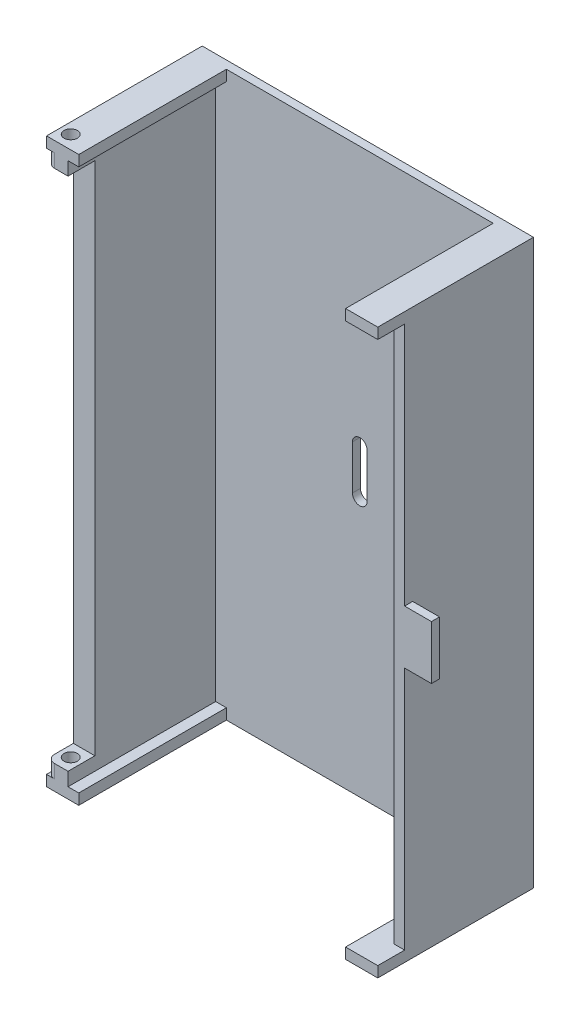
ISO-10303-21;
HEADER;
FILE_DESCRIPTION(('STEP AP214'),'2;1');
FILE_NAME('part.step','',(''),(''),'','','');
FILE_SCHEMA(('AUTOMOTIVE_DESIGN { 1 0 10303 214 1 1 1 1 }'));
ENDSEC;
DATA;
#1=APPLICATION_CONTEXT('core data for automotive mechanical design processes');
#2=APPLICATION_PROTOCOL_DEFINITION('international standard','automotive_design',2000,#1);
#3=PRODUCT_CONTEXT('',#1,'mechanical');
#4=PRODUCT('Part','Part','',(#3));
#5=PRODUCT_RELATED_PRODUCT_CATEGORY('part','',(#4));
#6=PRODUCT_DEFINITION_FORMATION('','',#4);
#7=PRODUCT_DEFINITION_CONTEXT('part definition',#1,'design');
#8=PRODUCT_DEFINITION('design','',#6,#7);
#9=PRODUCT_DEFINITION_SHAPE('','',#8);
#10=(LENGTH_UNIT() NAMED_UNIT(*) SI_UNIT(.MILLI.,.METRE.));
#11=(NAMED_UNIT(*) PLANE_ANGLE_UNIT() SI_UNIT($,.RADIAN.));
#12=(NAMED_UNIT(*) SI_UNIT($,.STERADIAN.) SOLID_ANGLE_UNIT());
#13=UNCERTAINTY_MEASURE_WITH_UNIT(LENGTH_MEASURE(1.E-05),#10,'distance_accuracy_value','');
#14=(GEOMETRIC_REPRESENTATION_CONTEXT(3) GLOBAL_UNCERTAINTY_ASSIGNED_CONTEXT((#13)) GLOBAL_UNIT_ASSIGNED_CONTEXT((#10,
#11,#12)) REPRESENTATION_CONTEXT('',''));
#15=CARTESIAN_POINT('',(0.,0.,0.));
#16=DIRECTION('',(0.,0.,1.));
#17=DIRECTION('',(1.,0.,0.));
#18=AXIS2_PLACEMENT_3D('',#15,#16,#17);
#19=CARTESIAN_POINT('',(2.95000000000002,-116.,58.));
#20=DIRECTION('',(0.,1.,0.));
#21=DIRECTION('',(0.,0.,1.));
#22=AXIS2_PLACEMENT_3D('',#19,#20,#21);
#23=PLANE('',#22);
#24=DIRECTION('',(0.,0.,-1.));
#25=VECTOR('',#24,1.);
#26=CARTESIAN_POINT('',(-58.75,-116.,58.));
#27=LINE('',#26,#25);
#28=CARTESIAN_POINT('',(-58.75,-116.,58.));
#29=VERTEX_POINT('',#28);
#30=CARTESIAN_POINT('',(-58.75,-116.,55.));
#31=VERTEX_POINT('',#30);
#32=EDGE_CURVE('E489',#29,#31,#27,.T.);
#33=ORIENTED_EDGE('',*,*,#32,.F.);
#34=DIRECTION('',(1.,0.,0.));
#35=VECTOR('',#34,1.);
#36=CARTESIAN_POINT('',(2.95000000000002,-116.,58.));
#37=LINE('',#36,#35);
#38=CARTESIAN_POINT('',(-55.75,-116.,57.9999999999996));
#39=VERTEX_POINT('',#38);
#40=EDGE_CURVE('E297',#29,#39,#37,.T.);
#41=ORIENTED_EDGE('',*,*,#40,.T.);
#42=CARTESIAN_POINT('',(-55.75,-116.,55.));
#43=DIRECTION('',(0.,1.,0.));
#44=DIRECTION('',(0.,0.,1.));
#45=AXIS2_PLACEMENT_3D('',#42,#43,#44);
#46=CIRCLE('',#45,3.);
#47=EDGE_CURVE('E47',#39,#31,#46,.F.);
#48=ORIENTED_EDGE('',*,*,#47,.T.);
#49=EDGE_LOOP('',(#33,#41,#48));
#50=FACE_BOUND('',#49,.T.);
#51=ADVANCED_FACE('F39',(#50),#23,.T.);
#52=CARTESIAN_POINT('',(-50.75,-116.,58.));
#53=VERTEX_POINT('',#52);
#54=CARTESIAN_POINT('',(-46.75,-116.,58.));
#55=VERTEX_POINT('',#54);
#56=EDGE_CURVE('E298',#53,#55,#37,.T.);
#57=ORIENTED_EDGE('',*,*,#56,.T.);
#58=DIRECTION('',(0.,0.,-1.));
#59=VECTOR('',#58,1.);
#60=CARTESIAN_POINT('',(-46.75,-116.,58.));
#61=LINE('',#60,#59);
#62=CARTESIAN_POINT('',(-46.75,-116.,3.00000000000001));
#63=VERTEX_POINT('',#62);
#64=EDGE_CURVE('E312',#55,#63,#61,.T.);
#65=ORIENTED_EDGE('',*,*,#64,.T.);
#66=DIRECTION('',(1.,0.,0.));
#67=VECTOR('',#66,1.);
#68=CARTESIAN_POINT('',(64.65,-116.,3.00000000000002));
#69=LINE('',#68,#67);
#70=CARTESIAN_POINT('',(-50.75,-116.,3.));
#71=VERTEX_POINT('',#70);
#72=EDGE_CURVE('E451',#71,#63,#69,.T.);
#73=ORIENTED_EDGE('',*,*,#72,.F.);
#74=DIRECTION('',(0.,0.,1.));
#75=VECTOR('',#74,1.);
#76=CARTESIAN_POINT('',(-50.75,-116.,58.));
#77=LINE('',#76,#75);
#78=EDGE_CURVE('E401',#71,#53,#77,.T.);
#79=ORIENTED_EDGE('',*,*,#78,.T.);
#80=EDGE_LOOP('',(#57,#65,#73,#79));
#81=FACE_BOUND('',#80,.T.);
#82=ADVANCED_FACE('F529',(#81),#23,.T.);
#83=CARTESIAN_POINT('',(2.95000000000001,86.,58.));
#84=DIRECTION('',(0.,1.,0.));
#85=DIRECTION('',(0.,0.,1.));
#86=AXIS2_PLACEMENT_3D('',#83,#84,#85);
#87=PLANE('',#86);
#88=DIRECTION('',(1.,0.,0.));
#89=VECTOR('',#88,1.);
#90=CARTESIAN_POINT('',(2.95000000000001,86.,58.));
#91=LINE('',#90,#89);
#92=CARTESIAN_POINT('',(-58.75,86.,58.));
#93=VERTEX_POINT('',#92);
#94=CARTESIAN_POINT('',(-55.75,86.,58.));
#95=VERTEX_POINT('',#94);
#96=EDGE_CURVE('E295',#93,#95,#91,.T.);
#97=ORIENTED_EDGE('',*,*,#96,.F.);
#98=DIRECTION('',(0.,0.,1.));
#99=VECTOR('',#98,1.);
#100=CARTESIAN_POINT('',(-58.75,86.,3.));
#101=LINE('',#100,#99);
#102=CARTESIAN_POINT('',(-58.75,86.,55.));
#103=VERTEX_POINT('',#102);
#104=EDGE_CURVE('E481',#103,#93,#101,.T.);
#105=ORIENTED_EDGE('',*,*,#104,.F.);
#106=CARTESIAN_POINT('',(-55.75,86.,55.));
#107=DIRECTION('',(0.,1.,0.));
#108=DIRECTION('',(0.,0.,1.));
#109=AXIS2_PLACEMENT_3D('',#106,#107,#108);
#110=CIRCLE('',#109,3.);
#111=EDGE_CURVE('E11',#103,#95,#110,.T.);
#112=ORIENTED_EDGE('',*,*,#111,.T.);
#113=EDGE_LOOP('',(#97,#105,#112));
#114=FACE_BOUND('',#113,.T.);
#115=ADVANCED_FACE('F556',(#114),#87,.F.);
#116=DIRECTION('',(0.,0.,-1.));
#117=VECTOR('',#116,1.);
#118=CARTESIAN_POINT('',(-46.75,86.,58.));
#119=LINE('',#118,#117);
#120=CARTESIAN_POINT('',(-46.75,86.,58.));
#121=VERTEX_POINT('',#120);
#122=CARTESIAN_POINT('',(-46.75,86.,3.00000000000001));
#123=VERTEX_POINT('',#122);
#124=EDGE_CURVE('E310',#121,#123,#119,.T.);
#125=ORIENTED_EDGE('',*,*,#124,.F.);
#126=CARTESIAN_POINT('',(-50.75,86.,58.));
#127=VERTEX_POINT('',#126);
#128=EDGE_CURVE('E267',#127,#121,#91,.T.);
#129=ORIENTED_EDGE('',*,*,#128,.F.);
#130=DIRECTION('',(0.,0.,-1.));
#131=VECTOR('',#130,1.);
#132=CARTESIAN_POINT('',(-50.75,86.,3.));
#133=LINE('',#132,#131);
#134=CARTESIAN_POINT('',(-50.75,86.,3.));
#135=VERTEX_POINT('',#134);
#136=EDGE_CURVE('E419',#127,#135,#133,.T.);
#137=ORIENTED_EDGE('',*,*,#136,.T.);
#138=DIRECTION('',(-1.,0.,0.));
#139=VECTOR('',#138,1.);
#140=CARTESIAN_POINT('',(64.65,86.,3.));
#141=LINE('',#140,#139);
#142=EDGE_CURVE('E432',#123,#135,#141,.T.);
#143=ORIENTED_EDGE('',*,*,#142,.F.);
#144=EDGE_LOOP('',(#125,#129,#137,#143));
#145=FACE_BOUND('',#144,.T.);
#146=ADVANCED_FACE('F540',(#145),#87,.F.);
#147=CARTESIAN_POINT('',(-58.75,90.,3.));
#148=DIRECTION('',(0.,-1.,0.));
#149=DIRECTION('',(1.,0.,0.));
#150=AXIS2_PLACEMENT_3D('',#147,#148,#149);
#151=PLANE('',#150);
#152=CARTESIAN_POINT('',(-54.75,90.,53.));
#153=DIRECTION('',(0.,-1.,0.));
#154=DIRECTION('',(0.,0.,-1.));
#155=AXIS2_PLACEMENT_3D('',#152,#153,#154);
#156=CIRCLE('',#155,2.5);
#157=CARTESIAN_POINT('',(-54.75,90.,50.5));
#158=VERTEX_POINT('',#157);
#159=EDGE_CURVE('E374',#158,#158,#156,.T.);
#160=ORIENTED_EDGE('',*,*,#159,.T.);
#161=EDGE_LOOP('',(#160));
#162=FACE_BOUND('',#161,.T.);
#163=DIRECTION('',(1.,0.,0.));
#164=VECTOR('',#163,1.);
#165=CARTESIAN_POINT('',(-99.800979040538,90.,58.));
#166=LINE('',#165,#164);
#167=CARTESIAN_POINT('',(-58.75,90.,58.));
#168=VERTEX_POINT('',#167);
#169=CARTESIAN_POINT('',(-46.75,90.,58.));
#170=VERTEX_POINT('',#169);
#171=EDGE_CURVE('E265',#168,#170,#166,.T.);
#172=ORIENTED_EDGE('',*,*,#171,.T.);
#173=DIRECTION('',(0.,0.,-1.));
#174=VECTOR('',#173,1.);
#175=CARTESIAN_POINT('',(-46.75,90.,0.));
#176=LINE('',#175,#174);
#177=CARTESIAN_POINT('',(-46.75,90.,3.00000000000001));
#178=VERTEX_POINT('',#177);
#179=EDGE_CURVE('E274',#170,#178,#176,.T.);
#180=ORIENTED_EDGE('',*,*,#179,.T.);
#181=DIRECTION('',(-1.,0.,0.));
#182=VECTOR('',#181,1.);
#183=CARTESIAN_POINT('',(0.,90.,3.00000000000001));
#184=LINE('',#183,#182);
#185=CARTESIAN_POINT('',(52.65,90.,3.));
#186=VERTEX_POINT('',#185);
#187=EDGE_CURVE('E271',#186,#178,#184,.T.);
#188=ORIENTED_EDGE('',*,*,#187,.F.);
#189=DIRECTION('',(0.,0.,-1.));
#190=VECTOR('',#189,1.);
#191=CARTESIAN_POINT('',(52.65,90.,0.));
#192=LINE('',#191,#190);
#193=CARTESIAN_POINT('',(52.65,90.,58.));
#194=VERTEX_POINT('',#193);
#195=EDGE_CURVE('E281',#194,#186,#192,.T.);
#196=ORIENTED_EDGE('',*,*,#195,.F.);
#197=CARTESIAN_POINT('',(64.65,90.,58.));
#198=VERTEX_POINT('',#197);
#199=EDGE_CURVE('E289',#194,#198,#166,.T.);
#200=ORIENTED_EDGE('',*,*,#199,.T.);
#201=DIRECTION('',(0.,0.,-1.));
#202=VECTOR('',#201,1.);
#203=CARTESIAN_POINT('',(64.65,90.,3.));
#204=LINE('',#203,#202);
#205=CARTESIAN_POINT('',(64.65,90.,0.));
#206=VERTEX_POINT('',#205);
#207=EDGE_CURVE('E478',#198,#206,#204,.T.);
#208=ORIENTED_EDGE('',*,*,#207,.T.);
#209=DIRECTION('',(-1.,0.,0.));
#210=VECTOR('',#209,1.);
#211=CARTESIAN_POINT('',(-58.75,90.,0.));
#212=LINE('',#211,#210);
#213=CARTESIAN_POINT('',(-58.75,90.,0.));
#214=VERTEX_POINT('',#213);
#215=EDGE_CURVE('E465',#206,#214,#212,.T.);
#216=ORIENTED_EDGE('',*,*,#215,.T.);
#217=DIRECTION('',(0.,0.,-1.));
#218=VECTOR('',#217,1.);
#219=CARTESIAN_POINT('',(-58.75,90.,3.));
#220=LINE('',#219,#218);
#221=EDGE_CURVE('E286',#168,#214,#220,.T.);
#222=ORIENTED_EDGE('',*,*,#221,.F.);
#223=EDGE_LOOP('',(#172,#180,#188,#196,#200,#208,#216,#222));
#224=FACE_BOUND('',#223,.T.);
#225=ADVANCED_FACE('F284',(#162,#224),#151,.F.);
#226=CARTESIAN_POINT('',(-58.75,-120.,3.));
#227=DIRECTION('',(0.,1.,0.));
#228=DIRECTION('',(-1.,0.,0.));
#229=AXIS2_PLACEMENT_3D('',#226,#227,#228);
#230=PLANE('',#229);
#231=CARTESIAN_POINT('',(-54.75,-120.,53.));
#232=DIRECTION('',(0.,1.,0.));
#233=DIRECTION('',(-1.,0.,0.));
#234=AXIS2_PLACEMENT_3D('',#231,#232,#233);
#235=CIRCLE('',#234,2.5);
#236=CARTESIAN_POINT('',(-57.25,-120.,53.));
#237=VERTEX_POINT('',#236);
#238=EDGE_CURVE('E394',#237,#237,#235,.F.);
#239=ORIENTED_EDGE('',*,*,#238,.F.);
#240=EDGE_LOOP('',(#239));
#241=FACE_BOUND('',#240,.T.);
#242=DIRECTION('',(-1.,0.,0.));
#243=VECTOR('',#242,1.);
#244=CARTESIAN_POINT('',(-99.8009790405379,-120.,58.));
#245=LINE('',#244,#243);
#246=CARTESIAN_POINT('',(-46.75,-120.,58.));
#247=VERTEX_POINT('',#246);
#248=CARTESIAN_POINT('',(-58.75,-120.,58.));
#249=VERTEX_POINT('',#248);
#250=EDGE_CURVE('E288',#247,#249,#245,.T.);
#251=ORIENTED_EDGE('',*,*,#250,.T.);
#252=DIRECTION('',(0.,0.,-1.));
#253=VECTOR('',#252,1.);
#254=CARTESIAN_POINT('',(-58.75,-120.,3.));
#255=LINE('',#254,#253);
#256=CARTESIAN_POINT('',(-58.75,-120.,0.));
#257=VERTEX_POINT('',#256);
#258=EDGE_CURVE('E474',#249,#257,#255,.T.);
#259=ORIENTED_EDGE('',*,*,#258,.T.);
#260=DIRECTION('',(1.,0.,0.));
#261=VECTOR('',#260,1.);
#262=CARTESIAN_POINT('',(-58.75,-120.,0.));
#263=LINE('',#262,#261);
#264=CARTESIAN_POINT('',(64.65,-120.,0.));
#265=VERTEX_POINT('',#264);
#266=EDGE_CURVE('E469',#257,#265,#263,.T.);
#267=ORIENTED_EDGE('',*,*,#266,.T.);
#268=DIRECTION('',(0.,0.,-1.));
#269=VECTOR('',#268,1.);
#270=CARTESIAN_POINT('',(64.65,-120.,3.));
#271=LINE('',#270,#269);
#272=CARTESIAN_POINT('',(64.65,-120.,58.));
#273=VERTEX_POINT('',#272);
#274=EDGE_CURVE('E471',#273,#265,#271,.T.);
#275=ORIENTED_EDGE('',*,*,#274,.F.);
#276=CARTESIAN_POINT('',(52.6500000000001,-120.,58.));
#277=VERTEX_POINT('',#276);
#278=EDGE_CURVE('E282',#273,#277,#245,.T.);
#279=ORIENTED_EDGE('',*,*,#278,.T.);
#280=DIRECTION('',(0.,0.,1.));
#281=VECTOR('',#280,1.);
#282=CARTESIAN_POINT('',(52.6500000000001,-120.,0.));
#283=LINE('',#282,#281);
#284=CARTESIAN_POINT('',(52.6500000000001,-120.,3.));
#285=VERTEX_POINT('',#284);
#286=EDGE_CURVE('E611',#285,#277,#283,.T.);
#287=ORIENTED_EDGE('',*,*,#286,.F.);
#288=DIRECTION('',(1.,0.,0.));
#289=VECTOR('',#288,1.);
#290=CARTESIAN_POINT('',(0.,-120.,3.00000000000001));
#291=LINE('',#290,#289);
#292=CARTESIAN_POINT('',(-46.75,-120.,3.00000000000001));
#293=VERTEX_POINT('',#292);
#294=EDGE_CURVE('E588',#293,#285,#291,.T.);
#295=ORIENTED_EDGE('',*,*,#294,.F.);
#296=DIRECTION('',(0.,0.,1.));
#297=VECTOR('',#296,1.);
#298=CARTESIAN_POINT('',(-46.75,-120.,0.));
#299=LINE('',#298,#297);
#300=EDGE_CURVE('E541',#293,#247,#299,.T.);
#301=ORIENTED_EDGE('',*,*,#300,.T.);
#302=EDGE_LOOP('',(#251,#259,#267,#275,#279,#287,#295,#301));
#303=FACE_BOUND('',#302,.T.);
#304=ADVANCED_FACE('F564',(#241,#303),#230,.F.);
#305=CARTESIAN_POINT('',(64.65,90.,3.));
#306=DIRECTION('',(-1.,0.,0.));
#307=DIRECTION('',(0.,-1.,0.));
#308=AXIS2_PLACEMENT_3D('',#305,#306,#307);
#309=PLANE('',#308);
#310=DIRECTION('',(0.,0.,1.));
#311=VECTOR('',#310,1.);
#312=CARTESIAN_POINT('',(64.65,-5.00000000000002,48.));
#313=LINE('',#312,#311);
#314=CARTESIAN_POINT('',(64.65,-5.00000000000002,45.));
#315=VERTEX_POINT('',#314);
#316=CARTESIAN_POINT('',(64.65,-5.00000000000003,48.));
#317=VERTEX_POINT('',#316);
#318=EDGE_CURVE('E329',#315,#317,#313,.T.);
#319=ORIENTED_EDGE('',*,*,#318,.F.);
#320=DIRECTION('',(0.,1.,0.));
#321=VECTOR('',#320,1.);
#322=CARTESIAN_POINT('',(64.65,-5.00000000000002,45.));
#323=LINE('',#322,#321);
#324=CARTESIAN_POINT('',(64.65,-25.,45.));
#325=VERTEX_POINT('',#324);
#326=EDGE_CURVE('E315',#325,#315,#323,.T.);
#327=ORIENTED_EDGE('',*,*,#326,.F.);
#328=DIRECTION('',(0.,0.,-1.));
#329=VECTOR('',#328,1.);
#330=CARTESIAN_POINT('',(64.65,-25.,48.));
#331=LINE('',#330,#329);
#332=CARTESIAN_POINT('',(64.65,-25.,48.));
#333=VERTEX_POINT('',#332);
#334=EDGE_CURVE('E320',#333,#325,#331,.T.);
#335=ORIENTED_EDGE('',*,*,#334,.F.);
#336=DIRECTION('',(0.,1.,0.));
#337=VECTOR('',#336,1.);
#338=CARTESIAN_POINT('',(64.65,85.9999999999999,48.));
#339=LINE('',#338,#337);
#340=CARTESIAN_POINT('',(64.65,-116.,48.));
#341=VERTEX_POINT('',#340);
#342=EDGE_CURVE('E371',#341,#333,#339,.T.);
#343=ORIENTED_EDGE('',*,*,#342,.F.);
#344=DIRECTION('',(0.,0.,1.));
#345=VECTOR('',#344,1.);
#346=CARTESIAN_POINT('',(64.65,-116.,58.));
#347=LINE('',#346,#345);
#348=CARTESIAN_POINT('',(64.65,-116.,58.));
#349=VERTEX_POINT('',#348);
#350=EDGE_CURVE('E454',#341,#349,#347,.T.);
#351=ORIENTED_EDGE('',*,*,#350,.T.);
#352=DIRECTION('',(0.,-1.,0.));
#353=VECTOR('',#352,1.);
#354=CARTESIAN_POINT('',(64.65,-116.,58.));
#355=LINE('',#354,#353);
#356=EDGE_CURVE('E457',#349,#273,#355,.T.);
#357=ORIENTED_EDGE('',*,*,#356,.T.);
#358=ORIENTED_EDGE('',*,*,#274,.T.);
#359=DIRECTION('',(0.,1.,0.));
#360=VECTOR('',#359,1.);
#361=CARTESIAN_POINT('',(64.65,90.,0.));
#362=LINE('',#361,#360);
#363=EDGE_CURVE('E460',#265,#206,#362,.T.);
#364=ORIENTED_EDGE('',*,*,#363,.T.);
#365=ORIENTED_EDGE('',*,*,#207,.F.);
#366=DIRECTION('',(0.,1.,0.));
#367=VECTOR('',#366,1.);
#368=CARTESIAN_POINT('',(64.65,86.,58.));
#369=LINE('',#368,#367);
#370=CARTESIAN_POINT('',(64.65,86.,58.));
#371=VERTEX_POINT('',#370);
#372=EDGE_CURVE('E447',#371,#198,#369,.T.);
#373=ORIENTED_EDGE('',*,*,#372,.F.);
#374=DIRECTION('',(0.,0.,-1.));
#375=VECTOR('',#374,1.);
#376=CARTESIAN_POINT('',(64.65,86.,58.));
#377=LINE('',#376,#375);
#378=CARTESIAN_POINT('',(64.65,86.,48.));
#379=VERTEX_POINT('',#378);
#380=EDGE_CURVE('E443',#371,#379,#377,.T.);
#381=ORIENTED_EDGE('',*,*,#380,.T.);
#382=EDGE_CURVE('E375',#317,#379,#339,.T.);
#383=ORIENTED_EDGE('',*,*,#382,.F.);
#384=EDGE_LOOP('',(#319,#327,#335,#343,#351,#357,#358,#364,#365,#373,#381,#383));
#385=FACE_BOUND('',#384,.T.);
#386=ADVANCED_FACE('F568',(#385),#309,.F.);
#387=CARTESIAN_POINT('',(0.,0.,3.));
#388=DIRECTION('',(0.,0.,1.));
#389=DIRECTION('',(1.,0.,0.));
#390=AXIS2_PLACEMENT_3D('',#387,#388,#389);
#391=PLANE('',#390);
#392=CARTESIAN_POINT('',(60.65,86.,3.));
#393=VERTEX_POINT('',#392);
#394=CARTESIAN_POINT('',(52.65,86.,3.));
#395=VERTEX_POINT('',#394);
#396=EDGE_CURVE('E440',#393,#395,#141,.T.);
#397=ORIENTED_EDGE('',*,*,#396,.T.);
#398=DIRECTION('',(0.,1.,0.));
#399=VECTOR('',#398,1.);
#400=CARTESIAN_POINT('',(52.6500000000001,-335.048174637048,3.));
#401=LINE('',#400,#399);
#402=EDGE_CURVE('E589',#395,#186,#401,.T.);
#403=ORIENTED_EDGE('',*,*,#402,.T.);
#404=ORIENTED_EDGE('',*,*,#187,.T.);
#405=DIRECTION('',(0.,1.,0.));
#406=VECTOR('',#405,1.);
#407=CARTESIAN_POINT('',(-46.75,-335.048174637048,3.00000000000001));
#408=LINE('',#407,#406);
#409=EDGE_CURVE('E277',#123,#178,#408,.T.);
#410=ORIENTED_EDGE('',*,*,#409,.F.);
#411=ORIENTED_EDGE('',*,*,#142,.T.);
#412=DIRECTION('',(0.,-1.,0.));
#413=VECTOR('',#412,1.);
#414=CARTESIAN_POINT('',(-50.75,-116.,3.));
#415=LINE('',#414,#413);
#416=EDGE_CURVE('E398',#135,#71,#415,.T.);
#417=ORIENTED_EDGE('',*,*,#416,.T.);
#418=ORIENTED_EDGE('',*,*,#72,.T.);
#419=EDGE_CURVE('E534',#293,#63,#408,.T.);
#420=ORIENTED_EDGE('',*,*,#419,.F.);
#421=ORIENTED_EDGE('',*,*,#294,.T.);
#422=CARTESIAN_POINT('',(52.6500000000001,-116.,3.));
#423=VERTEX_POINT('',#422);
#424=EDGE_CURVE('E584',#285,#423,#401,.T.);
#425=ORIENTED_EDGE('',*,*,#424,.T.);
#426=CARTESIAN_POINT('',(60.65,-116.,3.));
#427=VERTEX_POINT('',#426);
#428=EDGE_CURVE('E449',#423,#427,#69,.T.);
#429=ORIENTED_EDGE('',*,*,#428,.T.);
#430=DIRECTION('',(0.,-1.,0.));
#431=VECTOR('',#430,1.);
#432=CARTESIAN_POINT('',(60.65,-116.,3.));
#433=LINE('',#432,#431);
#434=EDGE_CURVE('E367',#393,#427,#433,.T.);
#435=ORIENTED_EDGE('',*,*,#434,.F.);
#436=EDGE_LOOP('',(#397,#403,#404,#410,#411,#417,#418,#420,#421,#425,#429,#435));
#437=FACE_BOUND('',#436,.T.);
#438=DIRECTION('',(0.,1.,0.));
#439=VECTOR('',#438,1.);
#440=CARTESIAN_POINT('',(5.69999999999998,0.,3.));
#441=LINE('',#440,#439);
#442=CARTESIAN_POINT('',(5.69999999999998,-23.25,3.));
#443=VERTEX_POINT('',#442);
#444=CARTESIAN_POINT('',(5.69999999999998,-6.75000000000001,3.));
#445=VERTEX_POINT('',#444);
#446=EDGE_CURVE('E364',#443,#445,#441,.T.);
#447=ORIENTED_EDGE('',*,*,#446,.F.);
#448=CARTESIAN_POINT('',(2.94999999999999,-23.25,3.));
#449=DIRECTION('',(0.,0.,1.));
#450=DIRECTION('',(1.,0.,0.));
#451=AXIS2_PLACEMENT_3D('',#448,#449,#450);
#452=CIRCLE('',#451,2.74999999999999);
#453=CARTESIAN_POINT('',(0.199999999999991,-23.25,3.));
#454=VERTEX_POINT('',#453);
#455=EDGE_CURVE('E352',#454,#443,#452,.T.);
#456=ORIENTED_EDGE('',*,*,#455,.F.);
#457=DIRECTION('',(0.,1.,0.));
#458=VECTOR('',#457,1.);
#459=CARTESIAN_POINT('',(0.199999999999992,0.,3.));
#460=LINE('',#459,#458);
#461=CARTESIAN_POINT('',(0.199999999999991,-6.75000000000001,3.));
#462=VERTEX_POINT('',#461);
#463=EDGE_CURVE('E359',#454,#462,#460,.T.);
#464=ORIENTED_EDGE('',*,*,#463,.T.);
#465=CARTESIAN_POINT('',(2.94999999999999,-6.75000000000001,3.));
#466=DIRECTION('',(0.,0.,1.));
#467=DIRECTION('',(1.,0.,0.));
#468=AXIS2_PLACEMENT_3D('',#465,#466,#467);
#469=CIRCLE('',#468,2.74999999999999);
#470=EDGE_CURVE('E362',#445,#462,#469,.T.);
#471=ORIENTED_EDGE('',*,*,#470,.F.);
#472=EDGE_LOOP('',(#447,#456,#464,#471));
#473=FACE_BOUND('',#472,.T.);
#474=ADVANCED_FACE('F532',(#437,#473),#391,.T.);
#475=DIRECTION('',(0.,0.,-1.));
#476=VECTOR('',#475,1.);
#477=CARTESIAN_POINT('',(52.6500000000001,-116.,58.));
#478=LINE('',#477,#476);
#479=CARTESIAN_POINT('',(52.6500000000001,-116.,58.));
#480=VERTEX_POINT('',#479);
#481=EDGE_CURVE('E308',#480,#423,#478,.T.);
#482=ORIENTED_EDGE('',*,*,#481,.F.);
#483=DIRECTION('',(1.,0.,0.));
#484=VECTOR('',#483,1.);
#485=CARTESIAN_POINT('',(2.95000000000002,-116.,58.));
#486=LINE('',#485,#484);
#487=EDGE_CURVE('E302',#480,#349,#486,.T.);
#488=ORIENTED_EDGE('',*,*,#487,.T.);
#489=ORIENTED_EDGE('',*,*,#350,.F.);
#490=DIRECTION('',(1.,0.,0.));
#491=VECTOR('',#490,1.);
#492=CARTESIAN_POINT('',(64.65,-116.,48.));
#493=LINE('',#492,#491);
#494=CARTESIAN_POINT('',(60.65,-116.,48.0000000000001));
#495=VERTEX_POINT('',#494);
#496=EDGE_CURVE('E376',#495,#341,#493,.T.);
#497=ORIENTED_EDGE('',*,*,#496,.F.);
#498=DIRECTION('',(0.,0.,-1.));
#499=VECTOR('',#498,1.);
#500=CARTESIAN_POINT('',(60.65,-116.,250.039600078796));
#501=LINE('',#500,#499);
#502=EDGE_CURVE('E370',#495,#427,#501,.T.);
#503=ORIENTED_EDGE('',*,*,#502,.T.);
#504=ORIENTED_EDGE('',*,*,#428,.F.);
#505=EDGE_LOOP('',(#482,#488,#489,#497,#503,#504));
#506=FACE_BOUND('',#505,.T.);
#507=ADVANCED_FACE('F576',(#506),#23,.T.);
#508=DIRECTION('',(1.,0.,0.));
#509=VECTOR('',#508,1.);
#510=CARTESIAN_POINT('',(2.95000000000001,86.,58.));
#511=LINE('',#510,#509);
#512=CARTESIAN_POINT('',(52.65,86.,58.));
#513=VERTEX_POINT('',#512);
#514=EDGE_CURVE('E300',#513,#371,#511,.T.);
#515=ORIENTED_EDGE('',*,*,#514,.F.);
#516=DIRECTION('',(0.,0.,-1.));
#517=VECTOR('',#516,1.);
#518=CARTESIAN_POINT('',(52.65,86.,58.));
#519=LINE('',#518,#517);
#520=EDGE_CURVE('E305',#513,#395,#519,.T.);
#521=ORIENTED_EDGE('',*,*,#520,.T.);
#522=ORIENTED_EDGE('',*,*,#396,.F.);
#523=DIRECTION('',(0.,0.,-1.));
#524=VECTOR('',#523,1.);
#525=CARTESIAN_POINT('',(60.65,86.,250.039600078796));
#526=LINE('',#525,#524);
#527=CARTESIAN_POINT('',(60.65,86.,48.));
#528=VERTEX_POINT('',#527);
#529=EDGE_CURVE('E366',#528,#393,#526,.T.);
#530=ORIENTED_EDGE('',*,*,#529,.F.);
#531=DIRECTION('',(-1.,0.,0.));
#532=VECTOR('',#531,1.);
#533=CARTESIAN_POINT('',(60.65,86.,48.));
#534=LINE('',#533,#532);
#535=EDGE_CURVE('E382',#379,#528,#534,.T.);
#536=ORIENTED_EDGE('',*,*,#535,.F.);
#537=ORIENTED_EDGE('',*,*,#380,.F.);
#538=EDGE_LOOP('',(#515,#521,#522,#530,#536,#537));
#539=FACE_BOUND('',#538,.T.);
#540=ADVANCED_FACE('F632',(#539),#87,.F.);
#541=CARTESIAN_POINT('',(-58.75,90.,3.));
#542=DIRECTION('',(1.,0.,0.));
#543=DIRECTION('',(0.,1.,0.));
#544=AXIS2_PLACEMENT_3D('',#541,#542,#543);
#545=PLANE('',#544);
#546=ORIENTED_EDGE('',*,*,#32,.T.);
#547=DIRECTION('',(0.,1.,0.));
#548=VECTOR('',#547,1.);
#549=CARTESIAN_POINT('',(-58.75,-111.,55.));
#550=LINE('',#549,#548);
#551=CARTESIAN_POINT('',(-58.75,-111.,55.));
#552=VERTEX_POINT('',#551);
#553=EDGE_CURVE('E492',#31,#552,#550,.T.);
#554=ORIENTED_EDGE('',*,*,#553,.T.);
#555=DIRECTION('',(0.,0.,-1.));
#556=VECTOR('',#555,1.);
#557=CARTESIAN_POINT('',(-58.75,-111.,48.));
#558=LINE('',#557,#556);
#559=CARTESIAN_POINT('',(-58.75,-111.,48.));
#560=VERTEX_POINT('',#559);
#561=EDGE_CURVE('E397',#552,#560,#558,.T.);
#562=ORIENTED_EDGE('',*,*,#561,.T.);
#563=DIRECTION('',(0.,1.,0.));
#564=VECTOR('',#563,1.);
#565=CARTESIAN_POINT('',(-58.75,81.,48.));
#566=LINE('',#565,#564);
#567=CARTESIAN_POINT('',(-58.75,81.,48.));
#568=VERTEX_POINT('',#567);
#569=EDGE_CURVE('E424',#560,#568,#566,.T.);
#570=ORIENTED_EDGE('',*,*,#569,.T.);
#571=DIRECTION('',(0.,0.,1.));
#572=VECTOR('',#571,1.);
#573=CARTESIAN_POINT('',(-58.75,81.,58.));
#574=LINE('',#573,#572);
#575=CARTESIAN_POINT('',(-58.75,81.,55.));
#576=VERTEX_POINT('',#575);
#577=EDGE_CURVE('E402',#568,#576,#574,.T.);
#578=ORIENTED_EDGE('',*,*,#577,.T.);
#579=DIRECTION('',(0.,1.,0.));
#580=VECTOR('',#579,1.);
#581=CARTESIAN_POINT('',(-58.75,86.,55.));
#582=LINE('',#581,#580);
#583=EDGE_CURVE('E486',#576,#103,#582,.T.);
#584=ORIENTED_EDGE('',*,*,#583,.T.);
#585=ORIENTED_EDGE('',*,*,#104,.T.);
#586=DIRECTION('',(0.,1.,0.));
#587=VECTOR('',#586,1.);
#588=CARTESIAN_POINT('',(-58.75,86.,58.));
#589=LINE('',#588,#587);
#590=EDGE_CURVE('E446',#93,#168,#589,.T.);
#591=ORIENTED_EDGE('',*,*,#590,.T.);
#592=ORIENTED_EDGE('',*,*,#221,.T.);
#593=DIRECTION('',(0.,-1.,0.));
#594=VECTOR('',#593,1.);
#595=CARTESIAN_POINT('',(-58.75,90.,0.));
#596=LINE('',#595,#594);
#597=EDGE_CURVE('E467',#214,#257,#596,.T.);
#598=ORIENTED_EDGE('',*,*,#597,.T.);
#599=ORIENTED_EDGE('',*,*,#258,.F.);
#600=DIRECTION('',(0.,-1.,0.));
#601=VECTOR('',#600,1.);
#602=CARTESIAN_POINT('',(-58.75,-116.,58.));
#603=LINE('',#602,#601);
#604=EDGE_CURVE('E458',#29,#249,#603,.T.);
#605=ORIENTED_EDGE('',*,*,#604,.F.);
#606=EDGE_LOOP('',(#546,#554,#562,#570,#578,#584,#585,#591,#592,#598,#599,#605));
#607=FACE_BOUND('',#606,.T.);
#608=ADVANCED_FACE('F511',(#607),#545,.F.);
#609=CARTESIAN_POINT('',(0.,0.,0.));
#610=DIRECTION('',(0.,0.,1.));
#611=DIRECTION('',(1.,0.,0.));
#612=AXIS2_PLACEMENT_3D('',#609,#610,#611);
#613=PLANE('',#612);
#614=CARTESIAN_POINT('',(2.94999999999999,-23.25,0.));
#615=DIRECTION('',(0.,0.,-1.));
#616=DIRECTION('',(-1.,0.,0.));
#617=AXIS2_PLACEMENT_3D('',#614,#615,#616);
#618=CIRCLE('',#617,2.74999999999999);
#619=CARTESIAN_POINT('',(5.69999999999998,-23.25,0.));
#620=VERTEX_POINT('',#619);
#621=CARTESIAN_POINT('',(0.199999999999991,-23.25,0.));
#622=VERTEX_POINT('',#621);
#623=EDGE_CURVE('E341',#620,#622,#618,.T.);
#624=ORIENTED_EDGE('',*,*,#623,.F.);
#625=DIRECTION('',(0.,-1.,0.));
#626=VECTOR('',#625,1.);
#627=CARTESIAN_POINT('',(5.69999999999998,-6.75000000000001,0.));
#628=LINE('',#627,#626);
#629=CARTESIAN_POINT('',(5.69999999999998,-6.75000000000001,0.));
#630=VERTEX_POINT('',#629);
#631=EDGE_CURVE('E339',#630,#620,#628,.T.);
#632=ORIENTED_EDGE('',*,*,#631,.F.);
#633=CARTESIAN_POINT('',(2.94999999999999,-6.75000000000001,0.));
#634=DIRECTION('',(0.,0.,-1.));
#635=DIRECTION('',(-1.,0.,0.));
#636=AXIS2_PLACEMENT_3D('',#633,#634,#635);
#637=CIRCLE('',#636,2.74999999999999);
#638=CARTESIAN_POINT('',(0.199999999999991,-6.75000000000001,0.));
#639=VERTEX_POINT('',#638);
#640=EDGE_CURVE('E346',#639,#630,#637,.T.);
#641=ORIENTED_EDGE('',*,*,#640,.F.);
#642=DIRECTION('',(0.,-1.,0.));
#643=VECTOR('',#642,1.);
#644=CARTESIAN_POINT('',(0.199999999999991,-6.75000000000001,0.));
#645=LINE('',#644,#643);
#646=EDGE_CURVE('E343',#639,#622,#645,.T.);
#647=ORIENTED_EDGE('',*,*,#646,.T.);
#648=EDGE_LOOP('',(#624,#632,#641,#647));
#649=FACE_BOUND('',#648,.T.);
#650=ORIENTED_EDGE('',*,*,#363,.F.);
#651=ORIENTED_EDGE('',*,*,#266,.F.);
#652=ORIENTED_EDGE('',*,*,#597,.F.);
#653=ORIENTED_EDGE('',*,*,#215,.F.);
#654=EDGE_LOOP('',(#650,#651,#652,#653));
#655=FACE_BOUND('',#654,.T.);
#656=ADVANCED_FACE('F561',(#649,#655),#613,.F.);
#657=CARTESIAN_POINT('',(-50.75,86.,58.));
#658=DIRECTION('',(0.,0.,1.));
#659=DIRECTION('',(1.,0.,0.));
#660=AXIS2_PLACEMENT_3D('',#657,#658,#659);
#661=PLANE('',#660);
#662=DIRECTION('',(0.,1.,0.));
#663=VECTOR('',#662,1.);
#664=CARTESIAN_POINT('',(-50.75,86.,58.));
#665=LINE('',#664,#663);
#666=CARTESIAN_POINT('',(-50.75,81.,58.));
#667=VERTEX_POINT('',#666);
#668=EDGE_CURVE('E417',#667,#127,#665,.T.);
#669=ORIENTED_EDGE('',*,*,#668,.T.);
#670=ORIENTED_EDGE('',*,*,#128,.T.);
#671=DIRECTION('',(0.,1.,0.));
#672=VECTOR('',#671,1.);
#673=CARTESIAN_POINT('',(-46.75,-335.048174637048,58.));
#674=LINE('',#673,#672);
#675=EDGE_CURVE('E260',#121,#170,#674,.T.);
#676=ORIENTED_EDGE('',*,*,#675,.T.);
#677=ORIENTED_EDGE('',*,*,#171,.F.);
#678=ORIENTED_EDGE('',*,*,#590,.F.);
#679=ORIENTED_EDGE('',*,*,#96,.T.);
#680=DIRECTION('',(0.,1.,0.));
#681=VECTOR('',#680,1.);
#682=CARTESIAN_POINT('',(-55.75,81.,58.));
#683=LINE('',#682,#681);
#684=CARTESIAN_POINT('',(-55.75,81.,58.));
#685=VERTEX_POINT('',#684);
#686=EDGE_CURVE('E500',#95,#685,#683,.F.);
#687=ORIENTED_EDGE('',*,*,#686,.T.);
#688=DIRECTION('',(-1.,0.,0.));
#689=VECTOR('',#688,1.);
#690=CARTESIAN_POINT('',(-50.75,81.,58.));
#691=LINE('',#690,#689);
#692=EDGE_CURVE('E429',#667,#685,#691,.T.);
#693=ORIENTED_EDGE('',*,*,#692,.F.);
#694=EDGE_LOOP('',(#669,#670,#676,#677,#678,#679,#687,#693));
#695=FACE_BOUND('',#694,.T.);
#696=ADVANCED_FACE('F263',(#695),#661,.T.);
#697=CARTESIAN_POINT('',(-50.75,81.,58.));
#698=DIRECTION('',(0.,-1.,0.));
#699=DIRECTION('',(0.,0.,-1.));
#700=AXIS2_PLACEMENT_3D('',#697,#698,#699);
#701=PLANE('',#700);
#702=CARTESIAN_POINT('',(-54.75,81.,53.));
#703=DIRECTION('',(0.,-1.,0.));
#704=DIRECTION('',(0.,0.,-1.));
#705=AXIS2_PLACEMENT_3D('',#702,#703,#704);
#706=CIRCLE('',#705,2.5);
#707=CARTESIAN_POINT('',(-54.75,81.,50.5));
#708=VERTEX_POINT('',#707);
#709=EDGE_CURVE('E391',#708,#708,#706,.F.);
#710=ORIENTED_EDGE('',*,*,#709,.T.);
#711=EDGE_LOOP('',(#710));
#712=FACE_BOUND('',#711,.T.);
#713=ORIENTED_EDGE('',*,*,#692,.T.);
#714=CARTESIAN_POINT('',(-55.75,81.,55.));
#715=DIRECTION('',(0.,-1.,0.));
#716=DIRECTION('',(0.,0.,-1.));
#717=AXIS2_PLACEMENT_3D('',#714,#715,#716);
#718=CIRCLE('',#717,3.);
#719=EDGE_CURVE('E502',#685,#576,#718,.T.);
#720=ORIENTED_EDGE('',*,*,#719,.T.);
#721=ORIENTED_EDGE('',*,*,#577,.F.);
#722=DIRECTION('',(-1.,0.,0.));
#723=VECTOR('',#722,1.);
#724=CARTESIAN_POINT('',(-50.75,81.,48.));
#725=LINE('',#724,#723);
#726=CARTESIAN_POINT('',(-50.75,81.,48.));
#727=VERTEX_POINT('',#726);
#728=EDGE_CURVE('E433',#727,#568,#725,.T.);
#729=ORIENTED_EDGE('',*,*,#728,.F.);
#730=DIRECTION('',(0.,0.,1.));
#731=VECTOR('',#730,1.);
#732=CARTESIAN_POINT('',(-50.75,81.,58.));
#733=LINE('',#732,#731);
#734=EDGE_CURVE('E414',#727,#667,#733,.T.);
#735=ORIENTED_EDGE('',*,*,#734,.T.);
#736=EDGE_LOOP('',(#713,#720,#721,#729,#735));
#737=FACE_BOUND('',#736,.T.);
#738=ADVANCED_FACE('F544',(#712,#737),#701,.T.);
#739=CARTESIAN_POINT('',(-50.75,81.,48.));
#740=DIRECTION('',(0.,0.,1.));
#741=DIRECTION('',(0.,-1.,0.));
#742=AXIS2_PLACEMENT_3D('',#739,#740,#741);
#743=PLANE('',#742);
#744=ORIENTED_EDGE('',*,*,#569,.F.);
#745=DIRECTION('',(-1.,0.,0.));
#746=VECTOR('',#745,1.);
#747=CARTESIAN_POINT('',(-50.75,-111.,48.));
#748=LINE('',#747,#746);
#749=CARTESIAN_POINT('',(-50.75,-111.,48.));
#750=VERTEX_POINT('',#749);
#751=EDGE_CURVE('E435',#750,#560,#748,.T.);
#752=ORIENTED_EDGE('',*,*,#751,.F.);
#753=DIRECTION('',(0.,1.,0.));
#754=VECTOR('',#753,1.);
#755=CARTESIAN_POINT('',(-50.75,81.,48.));
#756=LINE('',#755,#754);
#757=EDGE_CURVE('E411',#750,#727,#756,.T.);
#758=ORIENTED_EDGE('',*,*,#757,.T.);
#759=ORIENTED_EDGE('',*,*,#728,.T.);
#760=EDGE_LOOP('',(#744,#752,#758,#759));
#761=FACE_BOUND('',#760,.T.);
#762=ADVANCED_FACE('F549',(#761),#743,.T.);
#763=CARTESIAN_POINT('',(-50.75,-111.,48.));
#764=DIRECTION('',(0.,1.,0.));
#765=DIRECTION('',(0.,0.,1.));
#766=AXIS2_PLACEMENT_3D('',#763,#764,#765);
#767=PLANE('',#766);
#768=CARTESIAN_POINT('',(-54.75,-111.,53.));
#769=DIRECTION('',(0.,1.,0.));
#770=DIRECTION('',(0.,0.,1.));
#771=AXIS2_PLACEMENT_3D('',#768,#769,#770);
#772=CIRCLE('',#771,2.5);
#773=CARTESIAN_POINT('',(-54.75,-111.,55.5));
#774=VERTEX_POINT('',#773);
#775=EDGE_CURVE('E390',#774,#774,#772,.F.);
#776=ORIENTED_EDGE('',*,*,#775,.T.);
#777=EDGE_LOOP('',(#776));
#778=FACE_BOUND('',#777,.T.);
#779=ORIENTED_EDGE('',*,*,#561,.F.);
#780=CARTESIAN_POINT('',(-55.75,-111.,55.));
#781=DIRECTION('',(0.,1.,0.));
#782=DIRECTION('',(0.,0.,1.));
#783=AXIS2_PLACEMENT_3D('',#780,#781,#782);
#784=CIRCLE('',#783,3.);
#785=CARTESIAN_POINT('',(-55.75,-111.,58.));
#786=VERTEX_POINT('',#785);
#787=EDGE_CURVE('E495',#552,#786,#784,.T.);
#788=ORIENTED_EDGE('',*,*,#787,.T.);
#789=DIRECTION('',(-1.,0.,0.));
#790=VECTOR('',#789,1.);
#791=CARTESIAN_POINT('',(-50.75,-111.,58.));
#792=LINE('',#791,#790);
#793=CARTESIAN_POINT('',(-50.75,-111.,58.));
#794=VERTEX_POINT('',#793);
#795=EDGE_CURVE('E422',#794,#786,#792,.T.);
#796=ORIENTED_EDGE('',*,*,#795,.F.);
#797=DIRECTION('',(0.,0.,-1.));
#798=VECTOR('',#797,1.);
#799=CARTESIAN_POINT('',(-50.75,-111.,48.));
#800=LINE('',#799,#798);
#801=EDGE_CURVE('E408',#794,#750,#800,.T.);
#802=ORIENTED_EDGE('',*,*,#801,.T.);
#803=ORIENTED_EDGE('',*,*,#751,.T.);
#804=EDGE_LOOP('',(#779,#788,#796,#802,#803));
#805=FACE_BOUND('',#804,.T.);
#806=ADVANCED_FACE('F516',(#778,#805),#767,.T.);
#807=CARTESIAN_POINT('',(-50.75,-111.,58.));
#808=DIRECTION('',(0.,0.,1.));
#809=DIRECTION('',(0.,-1.,0.));
#810=AXIS2_PLACEMENT_3D('',#807,#808,#809);
#811=PLANE('',#810);
#812=ORIENTED_EDGE('',*,*,#795,.T.);
#813=DIRECTION('',(0.,1.,0.));
#814=VECTOR('',#813,1.);
#815=CARTESIAN_POINT('',(-55.75,-116.,58.));
#816=LINE('',#815,#814);
#817=EDGE_CURVE('E497',#786,#39,#816,.F.);
#818=ORIENTED_EDGE('',*,*,#817,.T.);
#819=ORIENTED_EDGE('',*,*,#40,.F.);
#820=ORIENTED_EDGE('',*,*,#604,.T.);
#821=ORIENTED_EDGE('',*,*,#250,.F.);
#822=EDGE_CURVE('E270',#247,#55,#674,.T.);
#823=ORIENTED_EDGE('',*,*,#822,.T.);
#824=ORIENTED_EDGE('',*,*,#56,.F.);
#825=DIRECTION('',(0.,1.,0.));
#826=VECTOR('',#825,1.);
#827=CARTESIAN_POINT('',(-50.75,-111.,58.));
#828=LINE('',#827,#826);
#829=EDGE_CURVE('E405',#53,#794,#828,.T.);
#830=ORIENTED_EDGE('',*,*,#829,.T.);
#831=EDGE_LOOP('',(#812,#818,#819,#820,#821,#823,#824,#830));
#832=FACE_BOUND('',#831,.T.);
#833=ADVANCED_FACE('F519',(#832),#811,.T.);
#834=CARTESIAN_POINT('',(-50.75,0.,0.));
#835=DIRECTION('',(1.,0.,0.));
#836=DIRECTION('',(0.,0.,-1.));
#837=AXIS2_PLACEMENT_3D('',#834,#835,#836);
#838=PLANE('',#837);
#839=ORIENTED_EDGE('',*,*,#416,.F.);
#840=ORIENTED_EDGE('',*,*,#136,.F.);
#841=ORIENTED_EDGE('',*,*,#668,.F.);
#842=ORIENTED_EDGE('',*,*,#734,.F.);
#843=ORIENTED_EDGE('',*,*,#757,.F.);
#844=ORIENTED_EDGE('',*,*,#801,.F.);
#845=ORIENTED_EDGE('',*,*,#829,.F.);
#846=ORIENTED_EDGE('',*,*,#78,.F.);
#847=EDGE_LOOP('',(#839,#840,#841,#842,#843,#844,#845,#846));
#848=FACE_BOUND('',#847,.T.);
#849=ADVANCED_FACE('F525',(#848),#838,.T.);
#850=CARTESIAN_POINT('',(-54.75,-124.,53.));
#851=DIRECTION('',(0.,1.,0.));
#852=DIRECTION('',(0.,0.,1.));
#853=AXIS2_PLACEMENT_3D('',#850,#851,#852);
#854=CYLINDRICAL_SURFACE('',#853,2.5);
#855=ORIENTED_EDGE('',*,*,#775,.F.);
#856=EDGE_LOOP('',(#855));
#857=FACE_BOUND('',#856,.T.);
#858=ORIENTED_EDGE('',*,*,#238,.T.);
#859=EDGE_LOOP('',(#858));
#860=FACE_BOUND('',#859,.T.);
#861=ADVANCED_FACE('F660',(#857,#860),#854,.F.);
#862=ORIENTED_EDGE('',*,*,#709,.F.);
#863=EDGE_LOOP('',(#862));
#864=FACE_BOUND('',#863,.T.);
#865=ORIENTED_EDGE('',*,*,#159,.F.);
#866=EDGE_LOOP('',(#865));
#867=FACE_BOUND('',#866,.T.);
#868=ADVANCED_FACE('F654',(#864,#867),#854,.F.);
#869=CARTESIAN_POINT('',(-55.75,89.9999999999997,55.0000000000009));
#870=DIRECTION('',(0.,-1.,0.));
#871=DIRECTION('',(0.,0.,-1.));
#872=AXIS2_PLACEMENT_3D('',#869,#870,#871);
#873=CYLINDRICAL_SURFACE('',#872,3.);
#874=ORIENTED_EDGE('',*,*,#47,.F.);
#875=ORIENTED_EDGE('',*,*,#817,.F.);
#876=ORIENTED_EDGE('',*,*,#787,.F.);
#877=ORIENTED_EDGE('',*,*,#553,.F.);
#878=EDGE_LOOP('',(#874,#875,#876,#877));
#879=FACE_BOUND('',#878,.T.);
#880=ADVANCED_FACE('F514',(#879),#873,.T.);
#881=CARTESIAN_POINT('',(-55.75,90.,55.));
#882=DIRECTION('',(0.,-1.,0.));
#883=DIRECTION('',(1.,0.,0.));
#884=AXIS2_PLACEMENT_3D('',#881,#882,#883);
#885=CYLINDRICAL_SURFACE('',#884,3.);
#886=ORIENTED_EDGE('',*,*,#719,.F.);
#887=ORIENTED_EDGE('',*,*,#686,.F.);
#888=ORIENTED_EDGE('',*,*,#111,.F.);
#889=ORIENTED_EDGE('',*,*,#583,.F.);
#890=EDGE_LOOP('',(#886,#887,#888,#889));
#891=FACE_BOUND('',#890,.T.);
#892=ADVANCED_FACE('F41',(#891),#885,.T.);
#893=CARTESIAN_POINT('',(60.65,-116.,250.039600078796));
#894=DIRECTION('',(1.,0.,0.));
#895=DIRECTION('',(0.,0.,-1.));
#896=AXIS2_PLACEMENT_3D('',#893,#894,#895);
#897=PLANE('',#896);
#898=DIRECTION('',(0.,-1.,0.));
#899=VECTOR('',#898,1.);
#900=CARTESIAN_POINT('',(60.65,-116.,48.));
#901=LINE('',#900,#899);
#902=EDGE_CURVE('E379',#528,#495,#901,.T.);
#903=ORIENTED_EDGE('',*,*,#902,.F.);
#904=ORIENTED_EDGE('',*,*,#529,.T.);
#905=ORIENTED_EDGE('',*,*,#434,.T.);
#906=ORIENTED_EDGE('',*,*,#502,.F.);
#907=EDGE_LOOP('',(#903,#904,#905,#906));
#908=FACE_BOUND('',#907,.T.);
#909=ADVANCED_FACE('F659',(#908),#897,.F.);
#910=CARTESIAN_POINT('',(-50.75,81.,48.));
#911=DIRECTION('',(0.,0.,1.));
#912=DIRECTION('',(0.,-1.,0.));
#913=AXIS2_PLACEMENT_3D('',#910,#911,#912);
#914=PLANE('',#913);
#915=ORIENTED_EDGE('',*,*,#535,.T.);
#916=ORIENTED_EDGE('',*,*,#902,.T.);
#917=ORIENTED_EDGE('',*,*,#496,.T.);
#918=ORIENTED_EDGE('',*,*,#342,.T.);
#919=DIRECTION('',(-1.,0.,0.));
#920=VECTOR('',#919,1.);
#921=CARTESIAN_POINT('',(74.65,-25.,48.));
#922=LINE('',#921,#920);
#923=CARTESIAN_POINT('',(74.65,-25.,48.));
#924=VERTEX_POINT('',#923);
#925=EDGE_CURVE('E334',#924,#333,#922,.T.);
#926=ORIENTED_EDGE('',*,*,#925,.F.);
#927=DIRECTION('',(0.,-1.,0.));
#928=VECTOR('',#927,1.);
#929=CARTESIAN_POINT('',(74.65,-5.00000000000002,48.));
#930=LINE('',#929,#928);
#931=CARTESIAN_POINT('',(74.65,-5.00000000000002,48.));
#932=VERTEX_POINT('',#931);
#933=EDGE_CURVE('E322',#932,#924,#930,.T.);
#934=ORIENTED_EDGE('',*,*,#933,.F.);
#935=DIRECTION('',(-1.,0.,0.));
#936=VECTOR('',#935,1.);
#937=CARTESIAN_POINT('',(74.65,-5.00000000000002,48.));
#938=LINE('',#937,#936);
#939=EDGE_CURVE('E54',#932,#317,#938,.T.);
#940=ORIENTED_EDGE('',*,*,#939,.T.);
#941=ORIENTED_EDGE('',*,*,#382,.T.);
#942=EDGE_LOOP('',(#915,#916,#917,#918,#926,#934,#940,#941));
#943=FACE_BOUND('',#942,.T.);
#944=ADVANCED_FACE('F671',(#943),#914,.T.);
#945=CARTESIAN_POINT('',(5.69999999999998,-6.75000000000001,119.7));
#946=DIRECTION('',(1.,0.,0.));
#947=DIRECTION('',(0.,1.,0.));
#948=AXIS2_PLACEMENT_3D('',#945,#946,#947);
#949=PLANE('',#948);
#950=ORIENTED_EDGE('',*,*,#446,.T.);
#951=DIRECTION('',(0.,0.,-1.));
#952=VECTOR('',#951,1.);
#953=CARTESIAN_POINT('',(5.69999999999998,-6.75000000000001,119.7));
#954=LINE('',#953,#952);
#955=EDGE_CURVE('E350',#445,#630,#954,.T.);
#956=ORIENTED_EDGE('',*,*,#955,.T.);
#957=ORIENTED_EDGE('',*,*,#631,.T.);
#958=DIRECTION('',(0.,0.,-1.));
#959=VECTOR('',#958,1.);
#960=CARTESIAN_POINT('',(5.69999999999998,-23.25,119.7));
#961=LINE('',#960,#959);
#962=EDGE_CURVE('E349',#443,#620,#961,.T.);
#963=ORIENTED_EDGE('',*,*,#962,.F.);
#964=EDGE_LOOP('',(#950,#956,#957,#963));
#965=FACE_BOUND('',#964,.T.);
#966=ADVANCED_FACE('F743',(#965),#949,.F.);
#967=CARTESIAN_POINT('',(2.94999999999999,-6.75000000000001,119.7));
#968=DIRECTION('',(0.,0.,-1.));
#969=DIRECTION('',(-1.,0.,0.));
#970=AXIS2_PLACEMENT_3D('',#967,#968,#969);
#971=CYLINDRICAL_SURFACE('',#970,2.74999999999999);
#972=ORIENTED_EDGE('',*,*,#470,.T.);
#973=DIRECTION('',(0.,0.,-1.));
#974=VECTOR('',#973,1.);
#975=CARTESIAN_POINT('',(0.199999999999991,-6.75000000000001,119.7));
#976=LINE('',#975,#974);
#977=EDGE_CURVE('E353',#462,#639,#976,.T.);
#978=ORIENTED_EDGE('',*,*,#977,.T.);
#979=ORIENTED_EDGE('',*,*,#640,.T.);
#980=ORIENTED_EDGE('',*,*,#955,.F.);
#981=EDGE_LOOP('',(#972,#978,#979,#980));
#982=FACE_BOUND('',#981,.T.);
#983=ADVANCED_FACE('F748',(#982),#971,.F.);
#984=CARTESIAN_POINT('',(0.199999999999991,-6.75000000000001,119.7));
#985=DIRECTION('',(1.,0.,0.));
#986=DIRECTION('',(0.,1.,0.));
#987=AXIS2_PLACEMENT_3D('',#984,#985,#986);
#988=PLANE('',#987);
#989=DIRECTION('',(0.,0.,-1.));
#990=VECTOR('',#989,1.);
#991=CARTESIAN_POINT('',(0.199999999999991,-23.25,119.7));
#992=LINE('',#991,#990);
#993=EDGE_CURVE('E62',#454,#622,#992,.T.);
#994=ORIENTED_EDGE('',*,*,#993,.T.);
#995=ORIENTED_EDGE('',*,*,#646,.F.);
#996=ORIENTED_EDGE('',*,*,#977,.F.);
#997=ORIENTED_EDGE('',*,*,#463,.F.);
#998=EDGE_LOOP('',(#994,#995,#996,#997));
#999=FACE_BOUND('',#998,.T.);
#1000=ADVANCED_FACE('F758',(#999),#988,.T.);
#1001=CARTESIAN_POINT('',(2.94999999999999,-23.25,119.7));
#1002=DIRECTION('',(0.,0.,-1.));
#1003=DIRECTION('',(-1.,0.,0.));
#1004=AXIS2_PLACEMENT_3D('',#1001,#1002,#1003);
#1005=CYLINDRICAL_SURFACE('',#1004,2.74999999999999);
#1006=ORIENTED_EDGE('',*,*,#455,.T.);
#1007=ORIENTED_EDGE('',*,*,#962,.T.);
#1008=ORIENTED_EDGE('',*,*,#623,.T.);
#1009=ORIENTED_EDGE('',*,*,#993,.F.);
#1010=EDGE_LOOP('',(#1006,#1007,#1008,#1009));
#1011=FACE_BOUND('',#1010,.T.);
#1012=ADVANCED_FACE('F768',(#1011),#1005,.F.);
#1013=CARTESIAN_POINT('',(74.65,-5.00000000000002,45.));
#1014=DIRECTION('',(0.,0.,1.));
#1015=DIRECTION('',(1.,0.,0.));
#1016=AXIS2_PLACEMENT_3D('',#1013,#1014,#1015);
#1017=PLANE('',#1016);
#1018=ORIENTED_EDGE('',*,*,#326,.T.);
#1019=DIRECTION('',(-1.,0.,0.));
#1020=VECTOR('',#1019,1.);
#1021=CARTESIAN_POINT('',(74.65,-5.00000000000002,45.));
#1022=LINE('',#1021,#1020);
#1023=CARTESIAN_POINT('',(74.65,-5.00000000000002,45.));
#1024=VERTEX_POINT('',#1023);
#1025=EDGE_CURVE('E337',#1024,#315,#1022,.T.);
#1026=ORIENTED_EDGE('',*,*,#1025,.F.);
#1027=DIRECTION('',(0.,1.,0.));
#1028=VECTOR('',#1027,1.);
#1029=CARTESIAN_POINT('',(74.65,-5.00000000000002,45.));
#1030=LINE('',#1029,#1028);
#1031=CARTESIAN_POINT('',(74.65,-25.,45.));
#1032=VERTEX_POINT('',#1031);
#1033=EDGE_CURVE('E316',#1032,#1024,#1030,.T.);
#1034=ORIENTED_EDGE('',*,*,#1033,.F.);
#1035=DIRECTION('',(-1.,0.,0.));
#1036=VECTOR('',#1035,1.);
#1037=CARTESIAN_POINT('',(74.65,-25.,45.));
#1038=LINE('',#1037,#1036);
#1039=EDGE_CURVE('E326',#1032,#325,#1038,.T.);
#1040=ORIENTED_EDGE('',*,*,#1039,.T.);
#1041=EDGE_LOOP('',(#1018,#1026,#1034,#1040));
#1042=FACE_BOUND('',#1041,.T.);
#1043=ADVANCED_FACE('F778',(#1042),#1017,.F.);
#1044=CARTESIAN_POINT('',(74.65,-5.00000000000002,48.));
#1045=DIRECTION('',(0.,-1.,0.));
#1046=DIRECTION('',(1.,0.,0.));
#1047=AXIS2_PLACEMENT_3D('',#1044,#1045,#1046);
#1048=PLANE('',#1047);
#1049=ORIENTED_EDGE('',*,*,#318,.T.);
#1050=ORIENTED_EDGE('',*,*,#939,.F.);
#1051=DIRECTION('',(0.,0.,1.));
#1052=VECTOR('',#1051,1.);
#1053=CARTESIAN_POINT('',(74.65,-5.00000000000002,48.));
#1054=LINE('',#1053,#1052);
#1055=EDGE_CURVE('E319',#1024,#932,#1054,.T.);
#1056=ORIENTED_EDGE('',*,*,#1055,.F.);
#1057=ORIENTED_EDGE('',*,*,#1025,.T.);
#1058=EDGE_LOOP('',(#1049,#1050,#1056,#1057));
#1059=FACE_BOUND('',#1058,.T.);
#1060=ADVANCED_FACE('F795',(#1059),#1048,.F.);
#1061=CARTESIAN_POINT('',(74.65,-25.,48.));
#1062=DIRECTION('',(0.,1.,0.));
#1063=DIRECTION('',(-1.,0.,0.));
#1064=AXIS2_PLACEMENT_3D('',#1061,#1062,#1063);
#1065=PLANE('',#1064);
#1066=ORIENTED_EDGE('',*,*,#334,.T.);
#1067=ORIENTED_EDGE('',*,*,#1039,.F.);
#1068=DIRECTION('',(0.,0.,-1.));
#1069=VECTOR('',#1068,1.);
#1070=CARTESIAN_POINT('',(74.65,-25.,48.));
#1071=LINE('',#1070,#1069);
#1072=EDGE_CURVE('E324',#924,#1032,#1071,.T.);
#1073=ORIENTED_EDGE('',*,*,#1072,.F.);
#1074=ORIENTED_EDGE('',*,*,#925,.T.);
#1075=EDGE_LOOP('',(#1066,#1067,#1073,#1074));
#1076=FACE_BOUND('',#1075,.T.);
#1077=ADVANCED_FACE('F805',(#1076),#1065,.F.);
#1078=CARTESIAN_POINT('',(74.65,0.,0.));
#1079=DIRECTION('',(1.,0.,0.));
#1080=DIRECTION('',(0.,0.,-1.));
#1081=AXIS2_PLACEMENT_3D('',#1078,#1079,#1080);
#1082=PLANE('',#1081);
#1083=ORIENTED_EDGE('',*,*,#1033,.T.);
#1084=ORIENTED_EDGE('',*,*,#1055,.T.);
#1085=ORIENTED_EDGE('',*,*,#933,.T.);
#1086=ORIENTED_EDGE('',*,*,#1072,.T.);
#1087=EDGE_LOOP('',(#1083,#1084,#1085,#1086));
#1088=FACE_BOUND('',#1087,.T.);
#1089=ADVANCED_FACE('F623',(#1088),#1082,.T.);
#1090=CARTESIAN_POINT('',(-46.75,-335.048174637048,0.));
#1091=DIRECTION('',(1.,0.,0.));
#1092=DIRECTION('',(0.,1.,0.));
#1093=AXIS2_PLACEMENT_3D('',#1090,#1091,#1092);
#1094=PLANE('',#1093);
#1095=ORIENTED_EDGE('',*,*,#124,.T.);
#1096=ORIENTED_EDGE('',*,*,#409,.T.);
#1097=ORIENTED_EDGE('',*,*,#179,.F.);
#1098=ORIENTED_EDGE('',*,*,#675,.F.);
#1099=EDGE_LOOP('',(#1095,#1096,#1097,#1098));
#1100=FACE_BOUND('',#1099,.T.);
#1101=ADVANCED_FACE('F275',(#1100),#1094,.T.);
#1102=CARTESIAN_POINT('',(-99.8009790405379,-335.048174637048,58.));
#1103=DIRECTION('',(0.,0.,1.));
#1104=DIRECTION('',(1.,0.,0.));
#1105=AXIS2_PLACEMENT_3D('',#1102,#1103,#1104);
#1106=PLANE('',#1105);
#1107=ORIENTED_EDGE('',*,*,#514,.T.);
#1108=ORIENTED_EDGE('',*,*,#372,.T.);
#1109=ORIENTED_EDGE('',*,*,#199,.F.);
#1110=DIRECTION('',(0.,1.,0.));
#1111=VECTOR('',#1110,1.);
#1112=CARTESIAN_POINT('',(52.6500000000001,-335.048174637048,58.));
#1113=LINE('',#1112,#1111);
#1114=EDGE_CURVE('E594',#513,#194,#1113,.T.);
#1115=ORIENTED_EDGE('',*,*,#1114,.F.);
#1116=EDGE_LOOP('',(#1107,#1108,#1109,#1115));
#1117=FACE_BOUND('',#1116,.T.);
#1118=ADVANCED_FACE('F604',(#1117),#1106,.T.);
#1119=CARTESIAN_POINT('',(52.6500000000001,-335.048174637048,0.));
#1120=DIRECTION('',(1.,0.,0.));
#1121=DIRECTION('',(0.,1.,0.));
#1122=AXIS2_PLACEMENT_3D('',#1119,#1120,#1121);
#1123=PLANE('',#1122);
#1124=ORIENTED_EDGE('',*,*,#1114,.T.);
#1125=ORIENTED_EDGE('',*,*,#195,.T.);
#1126=ORIENTED_EDGE('',*,*,#402,.F.);
#1127=ORIENTED_EDGE('',*,*,#520,.F.);
#1128=EDGE_LOOP('',(#1124,#1125,#1126,#1127));
#1129=FACE_BOUND('',#1128,.T.);
#1130=ADVANCED_FACE('F600',(#1129),#1123,.F.);
#1131=ORIENTED_EDGE('',*,*,#822,.F.);
#1132=ORIENTED_EDGE('',*,*,#300,.F.);
#1133=ORIENTED_EDGE('',*,*,#419,.T.);
#1134=ORIENTED_EDGE('',*,*,#64,.F.);
#1135=EDGE_LOOP('',(#1131,#1132,#1133,#1134));
#1136=FACE_BOUND('',#1135,.T.);
#1137=ADVANCED_FACE('F613',(#1136),#1094,.T.);
#1138=ORIENTED_EDGE('',*,*,#481,.T.);
#1139=ORIENTED_EDGE('',*,*,#424,.F.);
#1140=ORIENTED_EDGE('',*,*,#286,.T.);
#1141=EDGE_CURVE('E586',#277,#480,#1113,.T.);
#1142=ORIENTED_EDGE('',*,*,#1141,.T.);
#1143=EDGE_LOOP('',(#1138,#1139,#1140,#1142));
#1144=FACE_BOUND('',#1143,.T.);
#1145=ADVANCED_FACE('F582',(#1144),#1123,.F.);
#1146=ORIENTED_EDGE('',*,*,#1141,.F.);
#1147=ORIENTED_EDGE('',*,*,#278,.F.);
#1148=ORIENTED_EDGE('',*,*,#356,.F.);
#1149=ORIENTED_EDGE('',*,*,#487,.F.);
#1150=EDGE_LOOP('',(#1146,#1147,#1148,#1149));
#1151=FACE_BOUND('',#1150,.T.);
#1152=ADVANCED_FACE('F572',(#1151),#1106,.T.);
#1153=CLOSED_SHELL('',(#51,#82,#115,#146,#225,#304,#386,#474,#507,#540,#608,#656,#696,#738,#762,
#806,#833,#849,#861,#868,#880,#892,#909,#944,#966,#983,#1000,#1012,#1043,#1060,#1077,#1089,
#1101,#1118,#1130,#1137,#1145,#1152));
#1154=MANIFOLD_SOLID_BREP('B2',#1153);
#1155=ADVANCED_BREP_SHAPE_REPRESENTATION('',(#18,#1154),#14);
#1156=SHAPE_DEFINITION_REPRESENTATION(#9,#1155);
ENDSEC;
END-ISO-10303-21;
